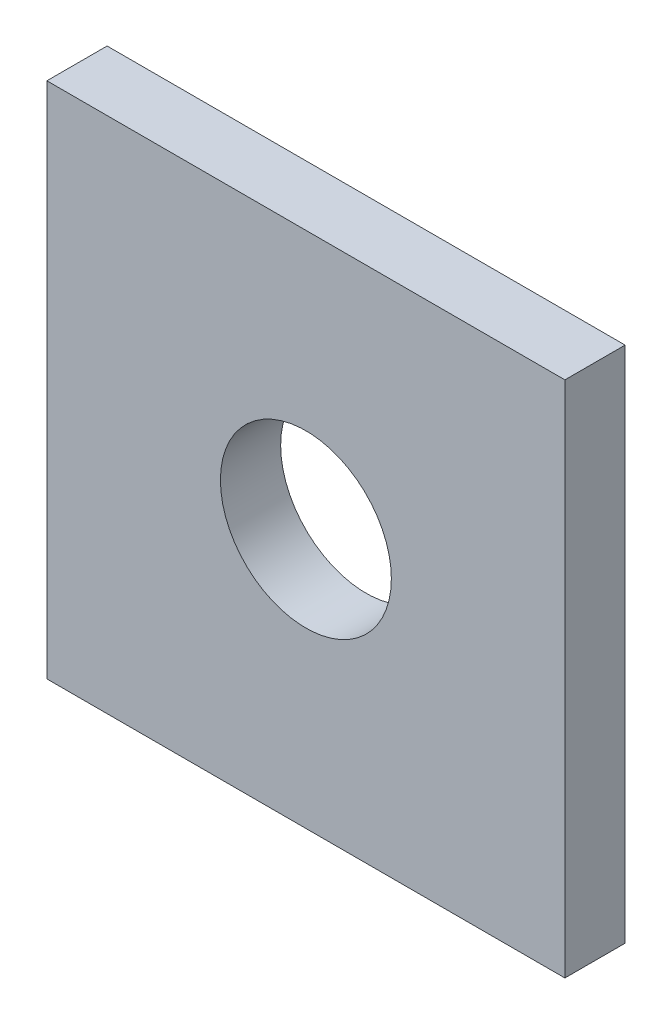
ISO-10303-21;
HEADER;
FILE_DESCRIPTION(('STEP AP214'),'2;1');
FILE_NAME('part.step','',(''),(''),'','','');
FILE_SCHEMA(('AUTOMOTIVE_DESIGN { 1 0 10303 214 1 1 1 1 }'));
ENDSEC;
DATA;
#1=APPLICATION_CONTEXT('core data for automotive mechanical design processes');
#2=APPLICATION_PROTOCOL_DEFINITION('international standard','automotive_design',2000,#1);
#3=PRODUCT_CONTEXT('',#1,'mechanical');
#4=PRODUCT('Part','Part','',(#3));
#5=PRODUCT_RELATED_PRODUCT_CATEGORY('part','',(#4));
#6=PRODUCT_DEFINITION_FORMATION('','',#4);
#7=PRODUCT_DEFINITION_CONTEXT('part definition',#1,'design');
#8=PRODUCT_DEFINITION('design','',#6,#7);
#9=PRODUCT_DEFINITION_SHAPE('','',#8);
#10=(LENGTH_UNIT() NAMED_UNIT(*) SI_UNIT(.MILLI.,.METRE.));
#11=(NAMED_UNIT(*) PLANE_ANGLE_UNIT() SI_UNIT($,.RADIAN.));
#12=(NAMED_UNIT(*) SI_UNIT($,.STERADIAN.) SOLID_ANGLE_UNIT());
#13=UNCERTAINTY_MEASURE_WITH_UNIT(LENGTH_MEASURE(1.E-05),#10,'distance_accuracy_value','');
#14=(GEOMETRIC_REPRESENTATION_CONTEXT(3) GLOBAL_UNCERTAINTY_ASSIGNED_CONTEXT((#13)) GLOBAL_UNIT_ASSIGNED_CONTEXT((#10,
#11,#12)) REPRESENTATION_CONTEXT('',''));
#15=CARTESIAN_POINT('',(0.,0.,0.));
#16=DIRECTION('',(0.,0.,1.));
#17=DIRECTION('',(1.,0.,0.));
#18=AXIS2_PLACEMENT_3D('',#15,#16,#17);
#19=CARTESIAN_POINT('',(0.,0.,10.));
#20=DIRECTION('',(0.,0.,1.));
#21=DIRECTION('',(1.,0.,0.));
#22=AXIS2_PLACEMENT_3D('',#19,#20,#21);
#23=PLANE('',#22);
#24=DIRECTION('',(0.,-1.,0.));
#25=VECTOR('',#24,1.);
#26=CARTESIAN_POINT('',(-43.,-43.,10.));
#27=LINE('',#26,#25);
#28=CARTESIAN_POINT('',(-43.,43.,10.));
#29=VERTEX_POINT('',#28);
#30=CARTESIAN_POINT('',(-43.,-43.,10.));
#31=VERTEX_POINT('',#30);
#32=EDGE_CURVE('E85',#29,#31,#27,.T.);
#33=ORIENTED_EDGE('',*,*,#32,.T.);
#34=DIRECTION('',(1.,0.,0.));
#35=VECTOR('',#34,1.);
#36=CARTESIAN_POINT('',(43.,-43.,10.));
#37=LINE('',#36,#35);
#38=CARTESIAN_POINT('',(43.,-43.,10.));
#39=VERTEX_POINT('',#38);
#40=EDGE_CURVE('E80',#31,#39,#37,.T.);
#41=ORIENTED_EDGE('',*,*,#40,.T.);
#42=DIRECTION('',(0.,1.,0.));
#43=VECTOR('',#42,1.);
#44=CARTESIAN_POINT('',(43.,-43.,10.));
#45=LINE('',#44,#43);
#46=CARTESIAN_POINT('',(43.,43.,10.));
#47=VERTEX_POINT('',#46);
#48=EDGE_CURVE('E83',#39,#47,#45,.T.);
#49=ORIENTED_EDGE('',*,*,#48,.T.);
#50=DIRECTION('',(-1.,0.,0.));
#51=VECTOR('',#50,1.);
#52=CARTESIAN_POINT('',(43.,43.,10.));
#53=LINE('',#52,#51);
#54=EDGE_CURVE('E50',#47,#29,#53,.T.);
#55=ORIENTED_EDGE('',*,*,#54,.T.);
#56=EDGE_LOOP('',(#33,#41,#49,#55));
#57=FACE_BOUND('',#56,.T.);
#58=CARTESIAN_POINT('',(0.,0.,10.));
#59=DIRECTION('',(0.,0.,1.));
#60=DIRECTION('',(1.,0.,0.));
#61=AXIS2_PLACEMENT_3D('',#58,#59,#60);
#62=CIRCLE('',#61,14.1897415964645);
#63=CARTESIAN_POINT('',(14.1897415964645,0.,10.));
#64=VERTEX_POINT('',#63);
#65=EDGE_CURVE('E100',#64,#64,#62,.T.);
#66=ORIENTED_EDGE('',*,*,#65,.F.);
#67=EDGE_LOOP('',(#66));
#68=FACE_BOUND('',#67,.T.);
#69=ADVANCED_FACE('F33',(#57,#68),#23,.T.);
#70=CARTESIAN_POINT('',(0.,0.,0.));
#71=DIRECTION('',(0.,0.,1.));
#72=DIRECTION('',(1.,0.,0.));
#73=AXIS2_PLACEMENT_3D('',#70,#71,#72);
#74=PLANE('',#73);
#75=DIRECTION('',(0.,-1.,0.));
#76=VECTOR('',#75,1.);
#77=CARTESIAN_POINT('',(-43.,-43.,0.));
#78=LINE('',#77,#76);
#79=CARTESIAN_POINT('',(-43.,43.,0.));
#80=VERTEX_POINT('',#79);
#81=CARTESIAN_POINT('',(-43.,-43.,0.));
#82=VERTEX_POINT('',#81);
#83=EDGE_CURVE('E97',#80,#82,#78,.T.);
#84=ORIENTED_EDGE('',*,*,#83,.F.);
#85=DIRECTION('',(-1.,0.,0.));
#86=VECTOR('',#85,1.);
#87=CARTESIAN_POINT('',(43.,43.,0.));
#88=LINE('',#87,#86);
#89=CARTESIAN_POINT('',(43.,43.,0.));
#90=VERTEX_POINT('',#89);
#91=EDGE_CURVE('E73',#90,#80,#88,.T.);
#92=ORIENTED_EDGE('',*,*,#91,.F.);
#93=DIRECTION('',(0.,1.,0.));
#94=VECTOR('',#93,1.);
#95=CARTESIAN_POINT('',(43.,-43.,0.));
#96=LINE('',#95,#94);
#97=CARTESIAN_POINT('',(43.,-43.,0.));
#98=VERTEX_POINT('',#97);
#99=EDGE_CURVE('E67',#98,#90,#96,.T.);
#100=ORIENTED_EDGE('',*,*,#99,.F.);
#101=DIRECTION('',(1.,0.,0.));
#102=VECTOR('',#101,1.);
#103=CARTESIAN_POINT('',(43.,-43.,0.));
#104=LINE('',#103,#102);
#105=EDGE_CURVE('E89',#82,#98,#104,.T.);
#106=ORIENTED_EDGE('',*,*,#105,.F.);
#107=EDGE_LOOP('',(#84,#92,#100,#106));
#108=FACE_BOUND('',#107,.T.);
#109=CARTESIAN_POINT('',(0.,0.,0.));
#110=DIRECTION('',(0.,0.,1.));
#111=DIRECTION('',(1.,0.,0.));
#112=AXIS2_PLACEMENT_3D('',#109,#110,#111);
#113=CIRCLE('',#112,14.1897415964645);
#114=CARTESIAN_POINT('',(14.1897415964645,0.,0.));
#115=VERTEX_POINT('',#114);
#116=EDGE_CURVE('E112',#115,#115,#113,.T.);
#117=ORIENTED_EDGE('',*,*,#116,.T.);
#118=EDGE_LOOP('',(#117));
#119=FACE_BOUND('',#118,.T.);
#120=ADVANCED_FACE('F108',(#108,#119),#74,.F.);
#121=CARTESIAN_POINT('',(-43.,-43.,10.));
#122=DIRECTION('',(1.,0.,0.));
#123=DIRECTION('',(0.,0.,-1.));
#124=AXIS2_PLACEMENT_3D('',#121,#122,#123);
#125=PLANE('',#124);
#126=ORIENTED_EDGE('',*,*,#83,.T.);
#127=DIRECTION('',(0.,0.,-1.));
#128=VECTOR('',#127,1.);
#129=CARTESIAN_POINT('',(-43.,-43.,10.));
#130=LINE('',#129,#128);
#131=EDGE_CURVE('E11',#31,#82,#130,.T.);
#132=ORIENTED_EDGE('',*,*,#131,.F.);
#133=ORIENTED_EDGE('',*,*,#32,.F.);
#134=DIRECTION('',(0.,0.,-1.));
#135=VECTOR('',#134,1.);
#136=CARTESIAN_POINT('',(-43.,43.,10.));
#137=LINE('',#136,#135);
#138=EDGE_CURVE('E93',#29,#80,#137,.T.);
#139=ORIENTED_EDGE('',*,*,#138,.T.);
#140=EDGE_LOOP('',(#126,#132,#133,#139));
#141=FACE_BOUND('',#140,.T.);
#142=ADVANCED_FACE('F35',(#141),#125,.F.);
#143=CARTESIAN_POINT('',(43.,-43.,10.));
#144=DIRECTION('',(0.,1.,0.));
#145=DIRECTION('',(-1.,0.,0.));
#146=AXIS2_PLACEMENT_3D('',#143,#144,#145);
#147=PLANE('',#146);
#148=ORIENTED_EDGE('',*,*,#105,.T.);
#149=DIRECTION('',(0.,0.,-1.));
#150=VECTOR('',#149,1.);
#151=CARTESIAN_POINT('',(43.,-43.,10.));
#152=LINE('',#151,#150);
#153=EDGE_CURVE('E42',#39,#98,#152,.T.);
#154=ORIENTED_EDGE('',*,*,#153,.F.);
#155=ORIENTED_EDGE('',*,*,#40,.F.);
#156=ORIENTED_EDGE('',*,*,#131,.T.);
#157=EDGE_LOOP('',(#148,#154,#155,#156));
#158=FACE_BOUND('',#157,.T.);
#159=ADVANCED_FACE('F88',(#158),#147,.F.);
#160=CARTESIAN_POINT('',(43.,-43.,10.));
#161=DIRECTION('',(-1.,0.,0.));
#162=DIRECTION('',(0.,0.,1.));
#163=AXIS2_PLACEMENT_3D('',#160,#161,#162);
#164=PLANE('',#163);
#165=ORIENTED_EDGE('',*,*,#99,.T.);
#166=DIRECTION('',(0.,0.,-1.));
#167=VECTOR('',#166,1.);
#168=CARTESIAN_POINT('',(43.,43.,10.));
#169=LINE('',#168,#167);
#170=EDGE_CURVE('E90',#47,#90,#169,.T.);
#171=ORIENTED_EDGE('',*,*,#170,.F.);
#172=ORIENTED_EDGE('',*,*,#48,.F.);
#173=ORIENTED_EDGE('',*,*,#153,.T.);
#174=EDGE_LOOP('',(#165,#171,#172,#173));
#175=FACE_BOUND('',#174,.T.);
#176=ADVANCED_FACE('F91',(#175),#164,.F.);
#177=CARTESIAN_POINT('',(43.,43.,10.));
#178=DIRECTION('',(0.,-1.,0.));
#179=DIRECTION('',(1.,0.,0.));
#180=AXIS2_PLACEMENT_3D('',#177,#178,#179);
#181=PLANE('',#180);
#182=ORIENTED_EDGE('',*,*,#91,.T.);
#183=ORIENTED_EDGE('',*,*,#138,.F.);
#184=ORIENTED_EDGE('',*,*,#54,.F.);
#185=ORIENTED_EDGE('',*,*,#170,.T.);
#186=EDGE_LOOP('',(#182,#183,#184,#185));
#187=FACE_BOUND('',#186,.T.);
#188=ADVANCED_FACE('F105',(#187),#181,.F.);
#189=CARTESIAN_POINT('',(0.,0.,10.));
#190=DIRECTION('',(0.,0.,-1.));
#191=DIRECTION('',(-1.,0.,0.));
#192=AXIS2_PLACEMENT_3D('',#189,#190,#191);
#193=CYLINDRICAL_SURFACE('',#192,14.1897415964645);
#194=ORIENTED_EDGE('',*,*,#65,.T.);
#195=EDGE_LOOP('',(#194));
#196=FACE_BOUND('',#195,.T.);
#197=ORIENTED_EDGE('',*,*,#116,.F.);
#198=EDGE_LOOP('',(#197));
#199=FACE_BOUND('',#198,.T.);
#200=ADVANCED_FACE('F118',(#196,#199),#193,.F.);
#201=CLOSED_SHELL('',(#69,#120,#142,#159,#176,#188,#200));
#202=MANIFOLD_SOLID_BREP('B2',#201);
#203=ADVANCED_BREP_SHAPE_REPRESENTATION('',(#18,#202),#14);
#204=SHAPE_DEFINITION_REPRESENTATION(#9,#203);
ENDSEC;
END-ISO-10303-21;
